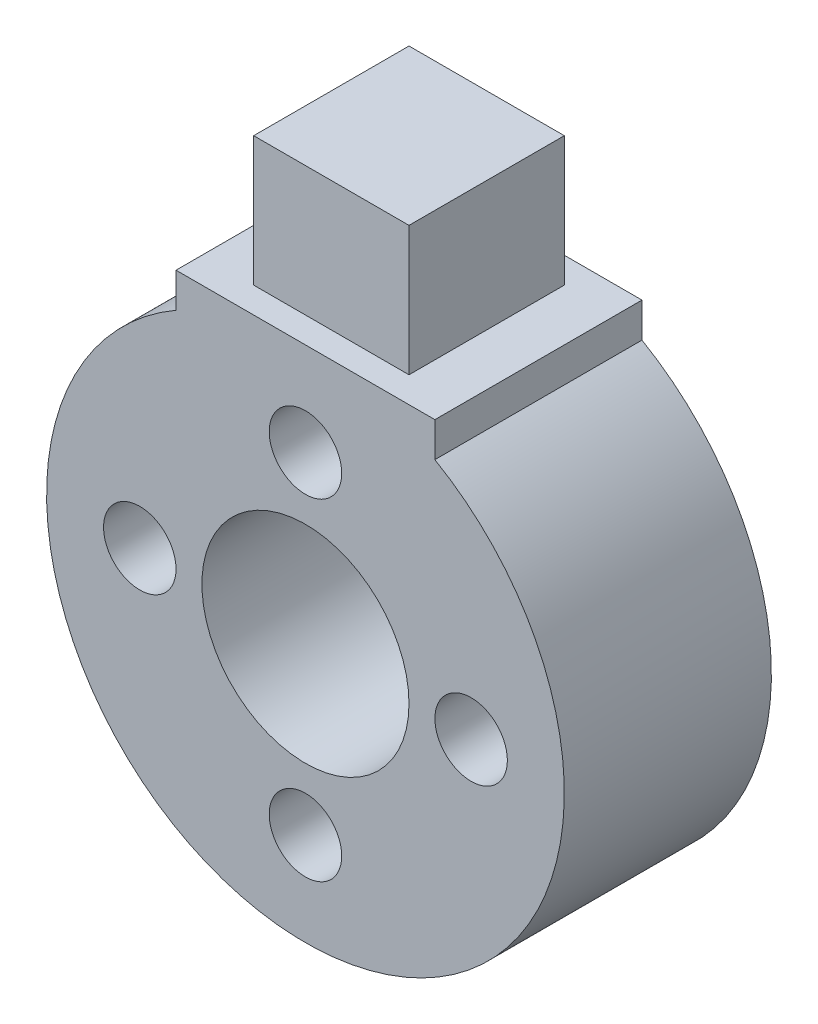
ISO-10303-21;
HEADER;
FILE_DESCRIPTION(('STEP AP214'),'2;1');
FILE_NAME('part.step','',(''),(''),'','','');
FILE_SCHEMA(('AUTOMOTIVE_DESIGN { 1 0 10303 214 1 1 1 1 }'));
ENDSEC;
DATA;
#1=APPLICATION_CONTEXT('core data for automotive mechanical design processes');
#2=APPLICATION_PROTOCOL_DEFINITION('international standard','automotive_design',2000,#1);
#3=PRODUCT_CONTEXT('',#1,'mechanical');
#4=PRODUCT('Part','Part','',(#3));
#5=PRODUCT_RELATED_PRODUCT_CATEGORY('part','',(#4));
#6=PRODUCT_DEFINITION_FORMATION('','',#4);
#7=PRODUCT_DEFINITION_CONTEXT('part definition',#1,'design');
#8=PRODUCT_DEFINITION('design','',#6,#7);
#9=PRODUCT_DEFINITION_SHAPE('','',#8);
#10=(LENGTH_UNIT() NAMED_UNIT(*) SI_UNIT(.MILLI.,.METRE.));
#11=(NAMED_UNIT(*) PLANE_ANGLE_UNIT() SI_UNIT($,.RADIAN.));
#12=(NAMED_UNIT(*) SI_UNIT($,.STERADIAN.) SOLID_ANGLE_UNIT());
#13=UNCERTAINTY_MEASURE_WITH_UNIT(LENGTH_MEASURE(1.E-05),#10,'distance_accuracy_value','');
#14=(GEOMETRIC_REPRESENTATION_CONTEXT(3) GLOBAL_UNCERTAINTY_ASSIGNED_CONTEXT((#13)) GLOBAL_UNIT_ASSIGNED_CONTEXT((#10,
#11,#12)) REPRESENTATION_CONTEXT('',''));
#15=CARTESIAN_POINT('',(0.,0.,0.));
#16=DIRECTION('',(0.,0.,1.));
#17=DIRECTION('',(1.,0.,0.));
#18=AXIS2_PLACEMENT_3D('',#15,#16,#17);
#19=CARTESIAN_POINT('',(0.,0.,10.16));
#20=DIRECTION('',(0.,0.,1.));
#21=DIRECTION('',(1.,0.,0.));
#22=AXIS2_PLACEMENT_3D('',#19,#20,#21);
#23=PLANE('',#22);
#24=CARTESIAN_POINT('',(8.12800000000081,8.07047700498613E-13,10.16));
#25=DIRECTION('',(0.,0.,1.));
#26=DIRECTION('',(1.,0.,0.));
#27=AXIS2_PLACEMENT_3D('',#24,#25,#26);
#28=CIRCLE('',#27,1.77800000000056);
#29=CARTESIAN_POINT('',(9.90600000000137,8.07047700498613E-13,10.16));
#30=VERTEX_POINT('',#29);
#31=EDGE_CURVE('E225',#30,#30,#28,.T.);
#32=ORIENTED_EDGE('',*,*,#31,.F.);
#33=EDGE_LOOP('',(#32));
#34=FACE_BOUND('',#33,.T.);
#35=CARTESIAN_POINT('',(1.61409540099723E-12,-8.128,10.16));
#36=DIRECTION('',(0.,0.,1.));
#37=DIRECTION('',(1.,0.,0.));
#38=AXIS2_PLACEMENT_3D('',#35,#36,#37);
#39=CIRCLE('',#38,1.7780000000016);
#40=CARTESIAN_POINT('',(1.77800000000321,-8.128,10.16));
#41=VERTEX_POINT('',#40);
#42=EDGE_CURVE('E241',#41,#41,#39,.T.);
#43=ORIENTED_EDGE('',*,*,#42,.F.);
#44=EDGE_LOOP('',(#43));
#45=FACE_BOUND('',#44,.T.);
#46=DIRECTION('',(1.,0.,0.));
#47=VECTOR('',#46,1.);
#48=CARTESIAN_POINT('',(-6.35,12.7,10.16));
#49=LINE('',#48,#47);
#50=CARTESIAN_POINT('',(-6.35,12.7,10.16));
#51=VERTEX_POINT('',#50);
#52=CARTESIAN_POINT('',(6.35,12.7,10.16));
#53=VERTEX_POINT('',#52);
#54=EDGE_CURVE('E257',#51,#53,#49,.T.);
#55=ORIENTED_EDGE('',*,*,#54,.F.);
#56=DIRECTION('',(0.,-1.,0.));
#57=VECTOR('',#56,1.);
#58=CARTESIAN_POINT('',(-6.35,12.7,10.16));
#59=LINE('',#58,#57);
#60=CARTESIAN_POINT('',(-6.35,10.9985226280624,10.16));
#61=VERTEX_POINT('',#60);
#62=EDGE_CURVE('E269',#51,#61,#59,.T.);
#63=ORIENTED_EDGE('',*,*,#62,.T.);
#64=CARTESIAN_POINT('',(0.,0.,10.16));
#65=DIRECTION('',(0.,0.,1.));
#66=DIRECTION('',(1.,0.,0.));
#67=AXIS2_PLACEMENT_3D('',#64,#65,#66);
#68=CIRCLE('',#67,12.7);
#69=CARTESIAN_POINT('',(6.35,10.9985226280624,10.16));
#70=VERTEX_POINT('',#69);
#71=EDGE_CURVE('E266',#61,#70,#68,.T.);
#72=ORIENTED_EDGE('',*,*,#71,.T.);
#73=DIRECTION('',(0.,-1.,0.));
#74=VECTOR('',#73,1.);
#75=CARTESIAN_POINT('',(6.35,12.7,10.16));
#76=LINE('',#75,#74);
#77=EDGE_CURVE('E261',#53,#70,#76,.T.);
#78=ORIENTED_EDGE('',*,*,#77,.F.);
#79=EDGE_LOOP('',(#55,#63,#72,#78));
#80=FACE_BOUND('',#79,.T.);
#81=CARTESIAN_POINT('',(0.,0.,10.16));
#82=DIRECTION('',(0.,0.,1.));
#83=DIRECTION('',(1.,0.,0.));
#84=AXIS2_PLACEMENT_3D('',#81,#82,#83);
#85=CIRCLE('',#84,5.08);
#86=CARTESIAN_POINT('',(5.08,0.,10.16));
#87=VERTEX_POINT('',#86);
#88=EDGE_CURVE('E249',#87,#87,#85,.T.);
#89=ORIENTED_EDGE('',*,*,#88,.F.);
#90=EDGE_LOOP('',(#89));
#91=FACE_BOUND('',#90,.T.);
#92=CARTESIAN_POINT('',(-8.12799999999919,-8.0804309341696E-13,10.16));
#93=DIRECTION('',(0.,0.,1.));
#94=DIRECTION('',(1.,0.,0.));
#95=AXIS2_PLACEMENT_3D('',#92,#93,#94);
#96=CIRCLE('',#95,1.77800000000109);
#97=CARTESIAN_POINT('',(-6.3499999999981,-8.0804309341696E-13,10.16));
#98=VERTEX_POINT('',#97);
#99=EDGE_CURVE('E233',#98,#98,#96,.T.);
#100=ORIENTED_EDGE('',*,*,#99,.F.);
#101=EDGE_LOOP('',(#100));
#102=FACE_BOUND('',#101,.T.);
#103=CARTESIAN_POINT('',(0.,8.128,10.16));
#104=DIRECTION('',(0.,0.,1.));
#105=DIRECTION('',(1.,0.,0.));
#106=AXIS2_PLACEMENT_3D('',#103,#104,#105);
#107=CIRCLE('',#106,1.778);
#108=CARTESIAN_POINT('',(1.778,8.128,10.16));
#109=VERTEX_POINT('',#108);
#110=EDGE_CURVE('E215',#109,#109,#107,.T.);
#111=ORIENTED_EDGE('',*,*,#110,.F.);
#112=EDGE_LOOP('',(#111));
#113=FACE_BOUND('',#112,.T.);
#114=ADVANCED_FACE('F120',(#34,#45,#80,#91,#102,#113),#23,.T.);
#115=CARTESIAN_POINT('',(0.,0.,0.));
#116=DIRECTION('',(0.,0.,1.));
#117=DIRECTION('',(1.,0.,0.));
#118=AXIS2_PLACEMENT_3D('',#115,#116,#117);
#119=PLANE('',#118);
#120=DIRECTION('',(1.,0.,0.));
#121=VECTOR('',#120,1.);
#122=CARTESIAN_POINT('',(-6.35,12.7,0.));
#123=LINE('',#122,#121);
#124=CARTESIAN_POINT('',(-6.35,12.7,0.));
#125=VERTEX_POINT('',#124);
#126=CARTESIAN_POINT('',(6.35,12.7,0.));
#127=VERTEX_POINT('',#126);
#128=EDGE_CURVE('E253',#125,#127,#123,.T.);
#129=ORIENTED_EDGE('',*,*,#128,.T.);
#130=DIRECTION('',(0.,-1.,0.));
#131=VECTOR('',#130,1.);
#132=CARTESIAN_POINT('',(6.35,12.7,0.));
#133=LINE('',#132,#131);
#134=CARTESIAN_POINT('',(6.35,10.9985226280624,0.));
#135=VERTEX_POINT('',#134);
#136=EDGE_CURVE('E275',#127,#135,#133,.T.);
#137=ORIENTED_EDGE('',*,*,#136,.T.);
#138=CARTESIAN_POINT('',(0.,0.,0.));
#139=DIRECTION('',(0.,0.,1.));
#140=DIRECTION('',(1.,0.,0.));
#141=AXIS2_PLACEMENT_3D('',#138,#139,#140);
#142=CIRCLE('',#141,12.7);
#143=CARTESIAN_POINT('',(-6.35,10.9985226280624,0.));
#144=VERTEX_POINT('',#143);
#145=EDGE_CURVE('E279',#144,#135,#142,.T.);
#146=ORIENTED_EDGE('',*,*,#145,.F.);
#147=DIRECTION('',(0.,-1.,0.));
#148=VECTOR('',#147,1.);
#149=CARTESIAN_POINT('',(-6.35,12.7,0.));
#150=LINE('',#149,#148);
#151=EDGE_CURVE('E262',#125,#144,#150,.T.);
#152=ORIENTED_EDGE('',*,*,#151,.F.);
#153=EDGE_LOOP('',(#129,#137,#146,#152));
#154=FACE_BOUND('',#153,.T.);
#155=CARTESIAN_POINT('',(0.,0.,0.));
#156=DIRECTION('',(0.,0.,1.));
#157=DIRECTION('',(1.,0.,0.));
#158=AXIS2_PLACEMENT_3D('',#155,#156,#157);
#159=CIRCLE('',#158,5.08);
#160=CARTESIAN_POINT('',(5.08,0.,0.));
#161=VERTEX_POINT('',#160);
#162=EDGE_CURVE('E245',#161,#161,#159,.T.);
#163=ORIENTED_EDGE('',*,*,#162,.T.);
#164=EDGE_LOOP('',(#163));
#165=FACE_BOUND('',#164,.T.);
#166=CARTESIAN_POINT('',(1.61409540099723E-12,-8.128,0.));
#167=DIRECTION('',(0.,0.,1.));
#168=DIRECTION('',(1.,0.,0.));
#169=AXIS2_PLACEMENT_3D('',#166,#167,#168);
#170=CIRCLE('',#169,1.7780000000016);
#171=CARTESIAN_POINT('',(1.77800000000321,-8.128,0.));
#172=VERTEX_POINT('',#171);
#173=EDGE_CURVE('E237',#172,#172,#170,.T.);
#174=ORIENTED_EDGE('',*,*,#173,.T.);
#175=EDGE_LOOP('',(#174));
#176=FACE_BOUND('',#175,.T.);
#177=CARTESIAN_POINT('',(-8.12799999999919,-8.0804309341696E-13,0.));
#178=DIRECTION('',(0.,0.,1.));
#179=DIRECTION('',(1.,0.,0.));
#180=AXIS2_PLACEMENT_3D('',#177,#178,#179);
#181=CIRCLE('',#180,1.77800000000109);
#182=CARTESIAN_POINT('',(-6.3499999999981,-8.0804309341696E-13,0.));
#183=VERTEX_POINT('',#182);
#184=EDGE_CURVE('E229',#183,#183,#181,.T.);
#185=ORIENTED_EDGE('',*,*,#184,.T.);
#186=EDGE_LOOP('',(#185));
#187=FACE_BOUND('',#186,.T.);
#188=CARTESIAN_POINT('',(8.12800000000081,8.07047700498613E-13,0.));
#189=DIRECTION('',(0.,0.,1.));
#190=DIRECTION('',(1.,0.,0.));
#191=AXIS2_PLACEMENT_3D('',#188,#189,#190);
#192=CIRCLE('',#191,1.77800000000056);
#193=CARTESIAN_POINT('',(9.90600000000137,8.07047700498613E-13,0.));
#194=VERTEX_POINT('',#193);
#195=EDGE_CURVE('E223',#194,#194,#192,.T.);
#196=ORIENTED_EDGE('',*,*,#195,.T.);
#197=EDGE_LOOP('',(#196));
#198=FACE_BOUND('',#197,.T.);
#199=CARTESIAN_POINT('',(0.,8.128,0.));
#200=DIRECTION('',(0.,0.,1.));
#201=DIRECTION('',(1.,0.,0.));
#202=AXIS2_PLACEMENT_3D('',#199,#200,#201);
#203=CIRCLE('',#202,1.778);
#204=CARTESIAN_POINT('',(1.778,8.128,0.));
#205=VERTEX_POINT('',#204);
#206=EDGE_CURVE('E210',#205,#205,#203,.T.);
#207=ORIENTED_EDGE('',*,*,#206,.T.);
#208=EDGE_LOOP('',(#207));
#209=FACE_BOUND('',#208,.T.);
#210=ADVANCED_FACE('F301',(#154,#165,#176,#187,#198,#209),#119,.F.);
#211=CARTESIAN_POINT('',(-6.35,12.7,10.16));
#212=DIRECTION('',(0.,1.,0.));
#213=DIRECTION('',(0.,0.,1.));
#214=AXIS2_PLACEMENT_3D('',#211,#212,#213);
#215=PLANE('',#214);
#216=DIRECTION('',(0.,0.,-1.));
#217=VECTOR('',#216,1.);
#218=CARTESIAN_POINT('',(3.81,12.7,1.27));
#219=LINE('',#218,#217);
#220=CARTESIAN_POINT('',(3.81,12.7,8.89));
#221=VERTEX_POINT('',#220);
#222=CARTESIAN_POINT('',(3.81,12.7,1.27));
#223=VERTEX_POINT('',#222);
#224=EDGE_CURVE('E138',#221,#223,#219,.T.);
#225=ORIENTED_EDGE('',*,*,#224,.F.);
#226=DIRECTION('',(1.,0.,0.));
#227=VECTOR('',#226,1.);
#228=CARTESIAN_POINT('',(-3.81,12.7,8.89));
#229=LINE('',#228,#227);
#230=CARTESIAN_POINT('',(-3.81,12.7,8.89));
#231=VERTEX_POINT('',#230);
#232=EDGE_CURVE('E142',#231,#221,#229,.T.);
#233=ORIENTED_EDGE('',*,*,#232,.F.);
#234=DIRECTION('',(0.,0.,1.));
#235=VECTOR('',#234,1.);
#236=CARTESIAN_POINT('',(-3.81,12.7,1.27));
#237=LINE('',#236,#235);
#238=CARTESIAN_POINT('',(-3.81,12.7,1.27));
#239=VERTEX_POINT('',#238);
#240=EDGE_CURVE('E500',#239,#231,#237,.T.);
#241=ORIENTED_EDGE('',*,*,#240,.F.);
#242=DIRECTION('',(-1.,0.,0.));
#243=VECTOR('',#242,1.);
#244=CARTESIAN_POINT('',(-3.81,12.7,1.27));
#245=LINE('',#244,#243);
#246=EDGE_CURVE('E510',#223,#239,#245,.T.);
#247=ORIENTED_EDGE('',*,*,#246,.F.);
#248=EDGE_LOOP('',(#225,#233,#241,#247));
#249=FACE_BOUND('',#248,.T.);
#250=ORIENTED_EDGE('',*,*,#128,.F.);
#251=DIRECTION('',(0.,0.,-1.));
#252=VECTOR('',#251,1.);
#253=CARTESIAN_POINT('',(-6.35,12.7,10.16));
#254=LINE('',#253,#252);
#255=EDGE_CURVE('E12',#51,#125,#254,.T.);
#256=ORIENTED_EDGE('',*,*,#255,.F.);
#257=ORIENTED_EDGE('',*,*,#54,.T.);
#258=DIRECTION('',(0.,0.,-1.));
#259=VECTOR('',#258,1.);
#260=CARTESIAN_POINT('',(6.35,12.7,10.16));
#261=LINE('',#260,#259);
#262=EDGE_CURVE('E124',#53,#127,#261,.T.);
#263=ORIENTED_EDGE('',*,*,#262,.T.);
#264=EDGE_LOOP('',(#250,#256,#257,#263));
#265=FACE_BOUND('',#264,.T.);
#266=ADVANCED_FACE('F122',(#249,#265),#215,.T.);
#267=CARTESIAN_POINT('',(-6.35,12.7,10.16));
#268=DIRECTION('',(1.,0.,0.));
#269=DIRECTION('',(0.,0.,-1.));
#270=AXIS2_PLACEMENT_3D('',#267,#268,#269);
#271=PLANE('',#270);
#272=ORIENTED_EDGE('',*,*,#151,.T.);
#273=DIRECTION('',(0.,0.,-1.));
#274=VECTOR('',#273,1.);
#275=CARTESIAN_POINT('',(-6.35,10.9985226280624,10.16));
#276=LINE('',#275,#274);
#277=EDGE_CURVE('E130',#61,#144,#276,.T.);
#278=ORIENTED_EDGE('',*,*,#277,.F.);
#279=ORIENTED_EDGE('',*,*,#62,.F.);
#280=ORIENTED_EDGE('',*,*,#255,.T.);
#281=EDGE_LOOP('',(#272,#278,#279,#280));
#282=FACE_BOUND('',#281,.T.);
#283=ADVANCED_FACE('F305',(#282),#271,.F.);
#284=CARTESIAN_POINT('',(0.,0.,10.16));
#285=DIRECTION('',(0.,0.,-1.));
#286=DIRECTION('',(-1.,0.,0.));
#287=AXIS2_PLACEMENT_3D('',#284,#285,#286);
#288=CYLINDRICAL_SURFACE('',#287,12.7);
#289=ORIENTED_EDGE('',*,*,#145,.T.);
#290=DIRECTION('',(0.,0.,-1.));
#291=VECTOR('',#290,1.);
#292=CARTESIAN_POINT('',(6.35,10.9985226280624,10.16));
#293=LINE('',#292,#291);
#294=EDGE_CURVE('E287',#70,#135,#293,.T.);
#295=ORIENTED_EDGE('',*,*,#294,.F.);
#296=ORIENTED_EDGE('',*,*,#71,.F.);
#297=ORIENTED_EDGE('',*,*,#277,.T.);
#298=EDGE_LOOP('',(#289,#295,#296,#297));
#299=FACE_BOUND('',#298,.T.);
#300=ADVANCED_FACE('F309',(#299),#288,.T.);
#301=CARTESIAN_POINT('',(6.35,12.7,10.16));
#302=DIRECTION('',(1.,0.,0.));
#303=DIRECTION('',(0.,0.,-1.));
#304=AXIS2_PLACEMENT_3D('',#301,#302,#303);
#305=PLANE('',#304);
#306=ORIENTED_EDGE('',*,*,#136,.F.);
#307=ORIENTED_EDGE('',*,*,#262,.F.);
#308=ORIENTED_EDGE('',*,*,#77,.T.);
#309=ORIENTED_EDGE('',*,*,#294,.T.);
#310=EDGE_LOOP('',(#306,#307,#308,#309));
#311=FACE_BOUND('',#310,.T.);
#312=ADVANCED_FACE('F297',(#311),#305,.T.);
#313=CARTESIAN_POINT('',(0.,0.,10.16));
#314=DIRECTION('',(0.,0.,-1.));
#315=DIRECTION('',(-1.,0.,0.));
#316=AXIS2_PLACEMENT_3D('',#313,#314,#315);
#317=CYLINDRICAL_SURFACE('',#316,5.08);
#318=ORIENTED_EDGE('',*,*,#88,.T.);
#319=EDGE_LOOP('',(#318));
#320=FACE_BOUND('',#319,.T.);
#321=ORIENTED_EDGE('',*,*,#162,.F.);
#322=EDGE_LOOP('',(#321));
#323=FACE_BOUND('',#322,.T.);
#324=ADVANCED_FACE('F339',(#320,#323),#317,.F.);
#325=CARTESIAN_POINT('',(1.61409540099723E-12,-8.128,10.16));
#326=DIRECTION('',(0.,0.,-1.));
#327=DIRECTION('',(-1.,0.,0.));
#328=AXIS2_PLACEMENT_3D('',#325,#326,#327);
#329=CYLINDRICAL_SURFACE('',#328,1.7780000000016);
#330=ORIENTED_EDGE('',*,*,#42,.T.);
#331=EDGE_LOOP('',(#330));
#332=FACE_BOUND('',#331,.T.);
#333=ORIENTED_EDGE('',*,*,#173,.F.);
#334=EDGE_LOOP('',(#333));
#335=FACE_BOUND('',#334,.T.);
#336=ADVANCED_FACE('F343',(#332,#335),#329,.F.);
#337=CARTESIAN_POINT('',(-8.12799999999919,-8.0804309341696E-13,10.16));
#338=DIRECTION('',(0.,0.,-1.));
#339=DIRECTION('',(-1.,0.,0.));
#340=AXIS2_PLACEMENT_3D('',#337,#338,#339);
#341=CYLINDRICAL_SURFACE('',#340,1.77800000000109);
#342=ORIENTED_EDGE('',*,*,#99,.T.);
#343=EDGE_LOOP('',(#342));
#344=FACE_BOUND('',#343,.T.);
#345=ORIENTED_EDGE('',*,*,#184,.F.);
#346=EDGE_LOOP('',(#345));
#347=FACE_BOUND('',#346,.T.);
#348=ADVANCED_FACE('F348',(#344,#347),#341,.F.);
#349=CARTESIAN_POINT('',(8.12800000000081,8.07047700498613E-13,10.16));
#350=DIRECTION('',(0.,0.,-1.));
#351=DIRECTION('',(-1.,0.,0.));
#352=AXIS2_PLACEMENT_3D('',#349,#350,#351);
#353=CYLINDRICAL_SURFACE('',#352,1.77800000000056);
#354=ORIENTED_EDGE('',*,*,#31,.T.);
#355=EDGE_LOOP('',(#354));
#356=FACE_BOUND('',#355,.T.);
#357=ORIENTED_EDGE('',*,*,#195,.F.);
#358=EDGE_LOOP('',(#357));
#359=FACE_BOUND('',#358,.T.);
#360=ADVANCED_FACE('F324',(#356,#359),#353,.F.);
#361=CARTESIAN_POINT('',(0.,8.128,10.16));
#362=DIRECTION('',(0.,0.,-1.));
#363=DIRECTION('',(-1.,0.,0.));
#364=AXIS2_PLACEMENT_3D('',#361,#362,#363);
#365=CYLINDRICAL_SURFACE('',#364,1.778);
#366=ORIENTED_EDGE('',*,*,#110,.T.);
#367=EDGE_LOOP('',(#366));
#368=FACE_BOUND('',#367,.T.);
#369=ORIENTED_EDGE('',*,*,#206,.F.);
#370=EDGE_LOOP('',(#369));
#371=FACE_BOUND('',#370,.T.);
#372=ADVANCED_FACE('F321',(#368,#371),#365,.F.);
#373=CARTESIAN_POINT('',(3.81,19.05,1.27));
#374=DIRECTION('',(-1.,0.,0.));
#375=DIRECTION('',(0.,0.,1.));
#376=AXIS2_PLACEMENT_3D('',#373,#374,#375);
#377=PLANE('',#376);
#378=ORIENTED_EDGE('',*,*,#224,.T.);
#379=DIRECTION('',(0.,-1.,0.));
#380=VECTOR('',#379,1.);
#381=CARTESIAN_POINT('',(3.81,19.05,1.27));
#382=LINE('',#381,#380);
#383=CARTESIAN_POINT('',(3.81,19.05,1.27));
#384=VERTEX_POINT('',#383);
#385=EDGE_CURVE('E190',#384,#223,#382,.T.);
#386=ORIENTED_EDGE('',*,*,#385,.F.);
#387=DIRECTION('',(0.,0.,-1.));
#388=VECTOR('',#387,1.);
#389=CARTESIAN_POINT('',(3.81,19.05,1.27));
#390=LINE('',#389,#388);
#391=CARTESIAN_POINT('',(3.81,19.05,8.89));
#392=VERTEX_POINT('',#391);
#393=EDGE_CURVE('E197',#392,#384,#390,.T.);
#394=ORIENTED_EDGE('',*,*,#393,.F.);
#395=DIRECTION('',(0.,-1.,0.));
#396=VECTOR('',#395,1.);
#397=CARTESIAN_POINT('',(3.81,19.05,8.89));
#398=LINE('',#397,#396);
#399=EDGE_CURVE('E497',#392,#221,#398,.T.);
#400=ORIENTED_EDGE('',*,*,#399,.T.);
#401=EDGE_LOOP('',(#378,#386,#394,#400));
#402=FACE_BOUND('',#401,.T.);
#403=ADVANCED_FACE('F208',(#402),#377,.F.);
#404=CARTESIAN_POINT('',(-3.81,19.05,1.27));
#405=DIRECTION('',(0.,0.,1.));
#406=DIRECTION('',(1.,0.,0.));
#407=AXIS2_PLACEMENT_3D('',#404,#405,#406);
#408=PLANE('',#407);
#409=ORIENTED_EDGE('',*,*,#246,.T.);
#410=DIRECTION('',(0.,-1.,0.));
#411=VECTOR('',#410,1.);
#412=CARTESIAN_POINT('',(-3.81,19.05,1.27));
#413=LINE('',#412,#411);
#414=CARTESIAN_POINT('',(-3.81,19.05,1.27));
#415=VERTEX_POINT('',#414);
#416=EDGE_CURVE('E192',#415,#239,#413,.T.);
#417=ORIENTED_EDGE('',*,*,#416,.F.);
#418=DIRECTION('',(-1.,0.,0.));
#419=VECTOR('',#418,1.);
#420=CARTESIAN_POINT('',(-3.81,19.05,1.27));
#421=LINE('',#420,#419);
#422=EDGE_CURVE('E185',#384,#415,#421,.T.);
#423=ORIENTED_EDGE('',*,*,#422,.F.);
#424=ORIENTED_EDGE('',*,*,#385,.T.);
#425=EDGE_LOOP('',(#409,#417,#423,#424));
#426=FACE_BOUND('',#425,.T.);
#427=ADVANCED_FACE('F188',(#426),#408,.F.);
#428=CARTESIAN_POINT('',(-3.81,19.05,1.27));
#429=DIRECTION('',(1.,0.,0.));
#430=DIRECTION('',(0.,0.,-1.));
#431=AXIS2_PLACEMENT_3D('',#428,#429,#430);
#432=PLANE('',#431);
#433=ORIENTED_EDGE('',*,*,#240,.T.);
#434=DIRECTION('',(0.,-1.,0.));
#435=VECTOR('',#434,1.);
#436=CARTESIAN_POINT('',(-3.81,19.05,8.89));
#437=LINE('',#436,#435);
#438=CARTESIAN_POINT('',(-3.81,19.05,8.89));
#439=VERTEX_POINT('',#438);
#440=EDGE_CURVE('E217',#439,#231,#437,.T.);
#441=ORIENTED_EDGE('',*,*,#440,.F.);
#442=DIRECTION('',(0.,0.,1.));
#443=VECTOR('',#442,1.);
#444=CARTESIAN_POINT('',(-3.81,19.05,1.27));
#445=LINE('',#444,#443);
#446=EDGE_CURVE('E196',#415,#439,#445,.T.);
#447=ORIENTED_EDGE('',*,*,#446,.F.);
#448=ORIENTED_EDGE('',*,*,#416,.T.);
#449=EDGE_LOOP('',(#433,#441,#447,#448));
#450=FACE_BOUND('',#449,.T.);
#451=ADVANCED_FACE('F363',(#450),#432,.F.);
#452=CARTESIAN_POINT('',(-3.81,19.05,8.89));
#453=DIRECTION('',(0.,0.,-1.));
#454=DIRECTION('',(-1.,0.,0.));
#455=AXIS2_PLACEMENT_3D('',#452,#453,#454);
#456=PLANE('',#455);
#457=ORIENTED_EDGE('',*,*,#232,.T.);
#458=ORIENTED_EDGE('',*,*,#399,.F.);
#459=DIRECTION('',(1.,0.,0.));
#460=VECTOR('',#459,1.);
#461=CARTESIAN_POINT('',(-3.81,19.05,8.89));
#462=LINE('',#461,#460);
#463=EDGE_CURVE('E202',#439,#392,#462,.T.);
#464=ORIENTED_EDGE('',*,*,#463,.F.);
#465=ORIENTED_EDGE('',*,*,#440,.T.);
#466=EDGE_LOOP('',(#457,#458,#464,#465));
#467=FACE_BOUND('',#466,.T.);
#468=ADVANCED_FACE('F366',(#467),#456,.F.);
#469=CARTESIAN_POINT('',(0.,19.05,0.));
#470=DIRECTION('',(0.,1.,0.));
#471=DIRECTION('',(0.,0.,1.));
#472=AXIS2_PLACEMENT_3D('',#469,#470,#471);
#473=PLANE('',#472);
#474=ORIENTED_EDGE('',*,*,#393,.T.);
#475=ORIENTED_EDGE('',*,*,#422,.T.);
#476=ORIENTED_EDGE('',*,*,#446,.T.);
#477=ORIENTED_EDGE('',*,*,#463,.T.);
#478=EDGE_LOOP('',(#474,#475,#476,#477));
#479=FACE_BOUND('',#478,.T.);
#480=ADVANCED_FACE('F200',(#479),#473,.T.);
#481=CLOSED_SHELL('',(#114,#210,#266,#283,#300,#312,#324,#336,#348,#360,#372,#403,#427,#451,
#468,#480));
#482=MANIFOLD_SOLID_BREP('B2',#481);
#483=ADVANCED_BREP_SHAPE_REPRESENTATION('',(#18,#482),#14);
#484=SHAPE_DEFINITION_REPRESENTATION(#9,#483);
ENDSEC;
END-ISO-10303-21;
